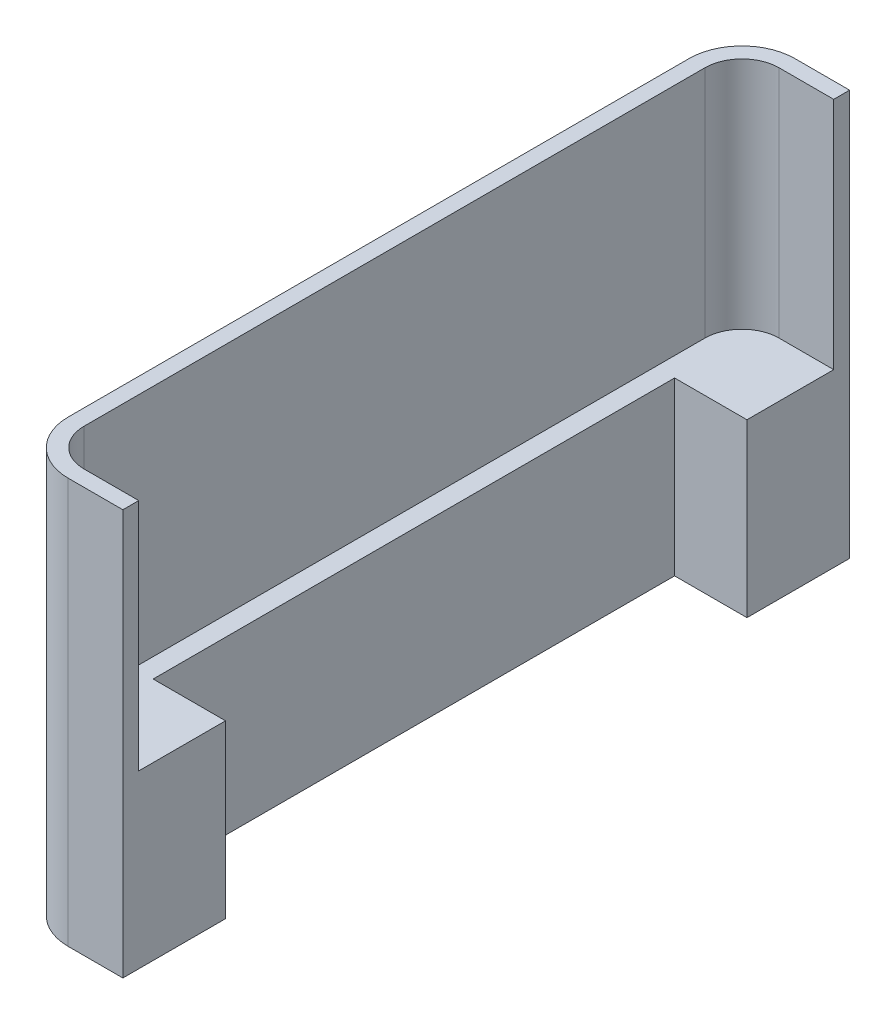
ISO-10303-21;
HEADER;
FILE_DESCRIPTION(('STEP AP214'),'2;1');
FILE_NAME('part.step','',(''),(''),'','','');
FILE_SCHEMA(('AUTOMOTIVE_DESIGN { 1 0 10303 214 1 1 1 1 }'));
ENDSEC;
DATA;
#1=APPLICATION_CONTEXT('core data for automotive mechanical design processes');
#2=APPLICATION_PROTOCOL_DEFINITION('international standard','automotive_design',2000,#1);
#3=PRODUCT_CONTEXT('',#1,'mechanical');
#4=PRODUCT('Part','Part','',(#3));
#5=PRODUCT_RELATED_PRODUCT_CATEGORY('part','',(#4));
#6=PRODUCT_DEFINITION_FORMATION('','',#4);
#7=PRODUCT_DEFINITION_CONTEXT('part definition',#1,'design');
#8=PRODUCT_DEFINITION('design','',#6,#7);
#9=PRODUCT_DEFINITION_SHAPE('','',#8);
#10=(LENGTH_UNIT() NAMED_UNIT(*) SI_UNIT(.MILLI.,.METRE.));
#11=(NAMED_UNIT(*) PLANE_ANGLE_UNIT() SI_UNIT($,.RADIAN.));
#12=(NAMED_UNIT(*) SI_UNIT($,.STERADIAN.) SOLID_ANGLE_UNIT());
#13=UNCERTAINTY_MEASURE_WITH_UNIT(LENGTH_MEASURE(1.E-05),#10,'distance_accuracy_value','');
#14=(GEOMETRIC_REPRESENTATION_CONTEXT(3) GLOBAL_UNCERTAINTY_ASSIGNED_CONTEXT((#13)) GLOBAL_UNIT_ASSIGNED_CONTEXT((#10,
#11,#12)) REPRESENTATION_CONTEXT('',''));
#15=CARTESIAN_POINT('',(0.,0.,0.));
#16=DIRECTION('',(0.,0.,1.));
#17=DIRECTION('',(1.,0.,0.));
#18=AXIS2_PLACEMENT_3D('',#15,#16,#17);
#19=CARTESIAN_POINT('',(-43.055,55.4230459880413,11.115));
#20=DIRECTION('',(-1.,0.,0.));
#21=DIRECTION('',(0.,0.,1.));
#22=AXIS2_PLACEMENT_3D('',#19,#20,#21);
#23=PLANE('',#22);
#24=DIRECTION('',(0.,0.,1.));
#25=VECTOR('',#24,1.);
#26=CARTESIAN_POINT('',(-43.055,9.7,10.365));
#27=LINE('',#26,#25);
#28=CARTESIAN_POINT('',(-43.055,9.7,6.27000000000001));
#29=VERTEX_POINT('',#28);
#30=CARTESIAN_POINT('',(-43.055,9.7,10.365));
#31=VERTEX_POINT('',#30);
#32=EDGE_CURVE('E294',#29,#31,#27,.T.);
#33=ORIENTED_EDGE('',*,*,#32,.T.);
#34=DIRECTION('',(0.,1.,0.));
#35=VECTOR('',#34,1.);
#36=CARTESIAN_POINT('',(-43.055,-23.3845719331534,10.365));
#37=LINE('',#36,#35);
#38=CARTESIAN_POINT('',(-43.055,20.7489,10.365));
#39=VERTEX_POINT('',#38);
#40=EDGE_CURVE('E183',#31,#39,#37,.T.);
#41=ORIENTED_EDGE('',*,*,#40,.T.);
#42=DIRECTION('',(0.,0.,-1.));
#43=VECTOR('',#42,1.);
#44=CARTESIAN_POINT('',(-43.055,20.7489,11.115));
#45=LINE('',#44,#43);
#46=CARTESIAN_POINT('',(-43.055,20.7489,11.115));
#47=VERTEX_POINT('',#46);
#48=EDGE_CURVE('E229',#47,#39,#45,.T.);
#49=ORIENTED_EDGE('',*,*,#48,.F.);
#50=DIRECTION('',(0.,-1.,0.));
#51=VECTOR('',#50,1.);
#52=CARTESIAN_POINT('',(-43.055,55.4230459880413,11.115));
#53=LINE('',#52,#51);
#54=CARTESIAN_POINT('',(-43.055,1.61,11.115));
#55=VERTEX_POINT('',#54);
#56=EDGE_CURVE('E226',#47,#55,#53,.T.);
#57=ORIENTED_EDGE('',*,*,#56,.T.);
#58=DIRECTION('',(0.,0.,-1.));
#59=VECTOR('',#58,1.);
#60=CARTESIAN_POINT('',(-43.055,1.61,11.115));
#61=LINE('',#60,#59);
#62=CARTESIAN_POINT('',(-43.055,1.61,6.27000000000001));
#63=VERTEX_POINT('',#62);
#64=EDGE_CURVE('E220',#55,#63,#61,.T.);
#65=ORIENTED_EDGE('',*,*,#64,.T.);
#66=DIRECTION('',(0.,1.,0.));
#67=VECTOR('',#66,1.);
#68=CARTESIAN_POINT('',(-43.055,1.61,6.27000000000001));
#69=LINE('',#68,#67);
#70=EDGE_CURVE('E212',#63,#29,#69,.T.);
#71=ORIENTED_EDGE('',*,*,#70,.T.);
#72=EDGE_LOOP('',(#33,#41,#49,#57,#65,#71));
#73=FACE_BOUND('',#72,.T.);
#74=ADVANCED_FACE('F33',(#73),#23,.F.);
#75=CARTESIAN_POINT('',(-43.055,20.7489,-22.435));
#76=VERTEX_POINT('',#75);
#77=CARTESIAN_POINT('',(-43.055,20.7489,-23.185));
#78=VERTEX_POINT('',#77);
#79=EDGE_CURVE('E233',#76,#78,#45,.T.);
#80=ORIENTED_EDGE('',*,*,#79,.F.);
#81=DIRECTION('',(0.,1.,0.));
#82=VECTOR('',#81,1.);
#83=CARTESIAN_POINT('',(-43.055,-23.3845719331534,-22.435));
#84=LINE('',#83,#82);
#85=CARTESIAN_POINT('',(-43.055,9.7,-22.435));
#86=VERTEX_POINT('',#85);
#87=EDGE_CURVE('E165',#86,#76,#84,.T.);
#88=ORIENTED_EDGE('',*,*,#87,.F.);
#89=CARTESIAN_POINT('',(-43.055,9.7,-18.34));
#90=VERTEX_POINT('',#89);
#91=EDGE_CURVE('E292',#86,#90,#27,.T.);
#92=ORIENTED_EDGE('',*,*,#91,.T.);
#93=DIRECTION('',(0.,1.,0.));
#94=VECTOR('',#93,1.);
#95=CARTESIAN_POINT('',(-43.055,1.61,-18.34));
#96=LINE('',#95,#94);
#97=CARTESIAN_POINT('',(-43.055,1.61,-18.34));
#98=VERTEX_POINT('',#97);
#99=EDGE_CURVE('E201',#98,#90,#96,.T.);
#100=ORIENTED_EDGE('',*,*,#99,.F.);
#101=CARTESIAN_POINT('',(-43.055,1.61,-23.185));
#102=VERTEX_POINT('',#101);
#103=EDGE_CURVE('E223',#98,#102,#61,.T.);
#104=ORIENTED_EDGE('',*,*,#103,.T.);
#105=DIRECTION('',(0.,-1.,0.));
#106=VECTOR('',#105,1.);
#107=CARTESIAN_POINT('',(-43.055,55.4230459880413,-23.185));
#108=LINE('',#107,#106);
#109=EDGE_CURVE('E219',#78,#102,#108,.T.);
#110=ORIENTED_EDGE('',*,*,#109,.F.);
#111=EDGE_LOOP('',(#80,#88,#92,#100,#104,#110));
#112=FACE_BOUND('',#111,.T.);
#113=ADVANCED_FACE('F283',(#112),#23,.F.);
#114=CARTESIAN_POINT('',(0.,1.61,0.));
#115=DIRECTION('',(0.,-1.,0.));
#116=DIRECTION('',(0.,0.,-1.));
#117=AXIS2_PLACEMENT_3D('',#114,#115,#116);
#118=PLANE('',#117);
#119=DIRECTION('',(0.,0.,-1.));
#120=VECTOR('',#119,1.);
#121=CARTESIAN_POINT('',(-46.47,1.61,6.27000000000001));
#122=LINE('',#121,#120);
#123=CARTESIAN_POINT('',(-46.47,1.61,6.27000000000001));
#124=VERTEX_POINT('',#123);
#125=CARTESIAN_POINT('',(-46.47,1.61,-18.34));
#126=VERTEX_POINT('',#125);
#127=EDGE_CURVE('E196',#124,#126,#122,.T.);
#128=ORIENTED_EDGE('',*,*,#127,.F.);
#129=DIRECTION('',(-1.,0.,0.));
#130=VECTOR('',#129,1.);
#131=CARTESIAN_POINT('',(-43.055,1.61,6.27000000000001));
#132=LINE('',#131,#130);
#133=EDGE_CURVE('E194',#63,#124,#132,.T.);
#134=ORIENTED_EDGE('',*,*,#133,.F.);
#135=ORIENTED_EDGE('',*,*,#64,.F.);
#136=DIRECTION('',(1.,0.,0.));
#137=VECTOR('',#136,1.);
#138=CARTESIAN_POINT('',(-48.135,1.61,11.115));
#139=LINE('',#138,#137);
#140=CARTESIAN_POINT('',(-45.635,1.61,11.115));
#141=VERTEX_POINT('',#140);
#142=EDGE_CURVE('E224',#141,#55,#139,.T.);
#143=ORIENTED_EDGE('',*,*,#142,.F.);
#144=CARTESIAN_POINT('',(-45.635,1.61,8.61500000000001));
#145=DIRECTION('',(0.,-1.,0.));
#146=DIRECTION('',(0.,0.,-1.));
#147=AXIS2_PLACEMENT_3D('',#144,#145,#146);
#148=CIRCLE('',#147,2.5);
#149=CARTESIAN_POINT('',(-48.135,1.61,8.61500000000001));
#150=VERTEX_POINT('',#149);
#151=EDGE_CURVE('E248',#141,#150,#148,.T.);
#152=ORIENTED_EDGE('',*,*,#151,.T.);
#153=DIRECTION('',(0.,0.,1.));
#154=VECTOR('',#153,1.);
#155=CARTESIAN_POINT('',(-48.135,1.61,11.115));
#156=LINE('',#155,#154);
#157=CARTESIAN_POINT('',(-48.135,1.61,-20.685));
#158=VERTEX_POINT('',#157);
#159=EDGE_CURVE('E215',#158,#150,#156,.T.);
#160=ORIENTED_EDGE('',*,*,#159,.F.);
#161=CARTESIAN_POINT('',(-45.635,1.61,-20.685));
#162=DIRECTION('',(0.,-1.,0.));
#163=DIRECTION('',(0.,0.,-1.));
#164=AXIS2_PLACEMENT_3D('',#161,#162,#163);
#165=CIRCLE('',#164,2.5);
#166=CARTESIAN_POINT('',(-45.635,1.61,-23.185));
#167=VERTEX_POINT('',#166);
#168=EDGE_CURVE('E246',#158,#167,#165,.T.);
#169=ORIENTED_EDGE('',*,*,#168,.T.);
#170=DIRECTION('',(-1.,0.,0.));
#171=VECTOR('',#170,1.);
#172=CARTESIAN_POINT('',(-48.135,1.61,-23.185));
#173=LINE('',#172,#171);
#174=EDGE_CURVE('E216',#102,#167,#173,.T.);
#175=ORIENTED_EDGE('',*,*,#174,.F.);
#176=ORIENTED_EDGE('',*,*,#103,.F.);
#177=DIRECTION('',(1.,0.,0.));
#178=VECTOR('',#177,1.);
#179=CARTESIAN_POINT('',(-43.055,1.61,-18.34));
#180=LINE('',#179,#178);
#181=EDGE_CURVE('E199',#126,#98,#180,.T.);
#182=ORIENTED_EDGE('',*,*,#181,.F.);
#183=EDGE_LOOP('',(#128,#134,#135,#143,#152,#160,#169,#175,#176,#182));
#184=FACE_BOUND('',#183,.T.);
#185=ADVANCED_FACE('F271',(#184),#118,.T.);
#186=CARTESIAN_POINT('',(-48.135,55.4230459880413,11.115));
#187=DIRECTION('',(1.,0.,0.));
#188=DIRECTION('',(0.,0.,-1.));
#189=AXIS2_PLACEMENT_3D('',#186,#187,#188);
#190=PLANE('',#189);
#191=ORIENTED_EDGE('',*,*,#159,.T.);
#192=DIRECTION('',(0.,-1.,0.));
#193=VECTOR('',#192,1.);
#194=CARTESIAN_POINT('',(-48.135,55.4230459880413,8.61500000000001));
#195=LINE('',#194,#193);
#196=CARTESIAN_POINT('',(-48.135,20.7489,8.61500000000001));
#197=VERTEX_POINT('',#196);
#198=EDGE_CURVE('E253',#150,#197,#195,.F.);
#199=ORIENTED_EDGE('',*,*,#198,.T.);
#200=DIRECTION('',(0.,0.,1.));
#201=VECTOR('',#200,1.);
#202=CARTESIAN_POINT('',(-48.135,20.7489,11.115));
#203=LINE('',#202,#201);
#204=CARTESIAN_POINT('',(-48.135,20.7489,-20.685));
#205=VERTEX_POINT('',#204);
#206=EDGE_CURVE('E236',#205,#197,#203,.T.);
#207=ORIENTED_EDGE('',*,*,#206,.F.);
#208=DIRECTION('',(0.,-1.,0.));
#209=VECTOR('',#208,1.);
#210=CARTESIAN_POINT('',(-48.135,55.4230459880413,-20.685));
#211=LINE('',#210,#209);
#212=EDGE_CURVE('E250',#205,#158,#211,.T.);
#213=ORIENTED_EDGE('',*,*,#212,.T.);
#214=EDGE_LOOP('',(#191,#199,#207,#213));
#215=FACE_BOUND('',#214,.T.);
#216=ADVANCED_FACE('F274',(#215),#190,.F.);
#217=CARTESIAN_POINT('',(-48.135,55.4230459880413,11.115));
#218=DIRECTION('',(0.,0.,-1.));
#219=DIRECTION('',(-1.,0.,0.));
#220=AXIS2_PLACEMENT_3D('',#217,#218,#219);
#221=PLANE('',#220);
#222=DIRECTION('',(1.,0.,0.));
#223=VECTOR('',#222,1.);
#224=CARTESIAN_POINT('',(-48.135,20.7489,11.115));
#225=LINE('',#224,#223);
#226=CARTESIAN_POINT('',(-45.635,20.7489,11.115));
#227=VERTEX_POINT('',#226);
#228=EDGE_CURVE('E234',#227,#47,#225,.T.);
#229=ORIENTED_EDGE('',*,*,#228,.F.);
#230=DIRECTION('',(0.,-1.,0.));
#231=VECTOR('',#230,1.);
#232=CARTESIAN_POINT('',(-45.635,55.4230459880413,11.115));
#233=LINE('',#232,#231);
#234=EDGE_CURVE('E232',#227,#141,#233,.T.);
#235=ORIENTED_EDGE('',*,*,#234,.T.);
#236=ORIENTED_EDGE('',*,*,#142,.T.);
#237=ORIENTED_EDGE('',*,*,#56,.F.);
#238=EDGE_LOOP('',(#229,#235,#236,#237));
#239=FACE_BOUND('',#238,.T.);
#240=ADVANCED_FACE('F265',(#239),#221,.F.);
#241=CARTESIAN_POINT('',(-48.135,55.4230459880413,-23.185));
#242=DIRECTION('',(0.,0.,1.));
#243=DIRECTION('',(1.,0.,0.));
#244=AXIS2_PLACEMENT_3D('',#241,#242,#243);
#245=PLANE('',#244);
#246=ORIENTED_EDGE('',*,*,#174,.T.);
#247=DIRECTION('',(0.,-1.,0.));
#248=VECTOR('',#247,1.);
#249=CARTESIAN_POINT('',(-45.635,55.4230459880413,-23.185));
#250=LINE('',#249,#248);
#251=CARTESIAN_POINT('',(-45.635,20.7489,-23.185));
#252=VERTEX_POINT('',#251);
#253=EDGE_CURVE('E11',#167,#252,#250,.F.);
#254=ORIENTED_EDGE('',*,*,#253,.T.);
#255=DIRECTION('',(-1.,0.,0.));
#256=VECTOR('',#255,1.);
#257=CARTESIAN_POINT('',(-48.135,20.7489,-23.185));
#258=LINE('',#257,#256);
#259=EDGE_CURVE('E218',#78,#252,#258,.T.);
#260=ORIENTED_EDGE('',*,*,#259,.F.);
#261=ORIENTED_EDGE('',*,*,#109,.T.);
#262=EDGE_LOOP('',(#246,#254,#260,#261));
#263=FACE_BOUND('',#262,.T.);
#264=ADVANCED_FACE('F280',(#263),#245,.F.);
#265=CARTESIAN_POINT('',(5.20499999999999,20.7489,8.56999999999999));
#266=DIRECTION('',(0.,1.,0.));
#267=DIRECTION('',(0.,0.,1.));
#268=AXIS2_PLACEMENT_3D('',#265,#266,#267);
#269=PLANE('',#268);
#270=DIRECTION('',(-1.,0.,0.));
#271=VECTOR('',#270,1.);
#272=CARTESIAN_POINT('',(-43.055,20.7489,-22.435));
#273=LINE('',#272,#271);
#274=CARTESIAN_POINT('',(-45.635,20.7489,-22.435));
#275=VERTEX_POINT('',#274);
#276=EDGE_CURVE('E162',#76,#275,#273,.T.);
#277=ORIENTED_EDGE('',*,*,#276,.F.);
#278=ORIENTED_EDGE('',*,*,#79,.T.);
#279=ORIENTED_EDGE('',*,*,#259,.T.);
#280=CARTESIAN_POINT('',(-45.635,20.7489,-20.685));
#281=DIRECTION('',(0.,1.,0.));
#282=DIRECTION('',(0.,0.,1.));
#283=AXIS2_PLACEMENT_3D('',#280,#281,#282);
#284=CIRCLE('',#283,2.5);
#285=EDGE_CURVE('E255',#252,#205,#284,.T.);
#286=ORIENTED_EDGE('',*,*,#285,.T.);
#287=ORIENTED_EDGE('',*,*,#206,.T.);
#288=CARTESIAN_POINT('',(-45.635,20.7489,8.61500000000001));
#289=DIRECTION('',(0.,1.,0.));
#290=DIRECTION('',(0.,0.,1.));
#291=AXIS2_PLACEMENT_3D('',#288,#289,#290);
#292=CIRCLE('',#291,2.5);
#293=EDGE_CURVE('E41',#197,#227,#292,.T.);
#294=ORIENTED_EDGE('',*,*,#293,.T.);
#295=ORIENTED_EDGE('',*,*,#228,.T.);
#296=ORIENTED_EDGE('',*,*,#48,.T.);
#297=DIRECTION('',(1.,0.,0.));
#298=VECTOR('',#297,1.);
#299=CARTESIAN_POINT('',(-45.635,20.7489,10.365));
#300=LINE('',#299,#298);
#301=CARTESIAN_POINT('',(-45.635,20.7489,10.365));
#302=VERTEX_POINT('',#301);
#303=EDGE_CURVE('E159',#302,#39,#300,.T.);
#304=ORIENTED_EDGE('',*,*,#303,.F.);
#305=CARTESIAN_POINT('',(-45.635,20.7489,8.61500000000001));
#306=DIRECTION('',(0.,1.,0.));
#307=DIRECTION('',(0.,0.,1.));
#308=AXIS2_PLACEMENT_3D('',#305,#306,#307);
#309=CIRCLE('',#308,1.75);
#310=CARTESIAN_POINT('',(-47.385,20.7489,8.61500000000001));
#311=VERTEX_POINT('',#310);
#312=EDGE_CURVE('E174',#311,#302,#309,.T.);
#313=ORIENTED_EDGE('',*,*,#312,.F.);
#314=DIRECTION('',(0.,0.,1.));
#315=VECTOR('',#314,1.);
#316=CARTESIAN_POINT('',(-47.385,20.7489,-20.685));
#317=LINE('',#316,#315);
#318=CARTESIAN_POINT('',(-47.385,20.7489,-20.685));
#319=VERTEX_POINT('',#318);
#320=EDGE_CURVE('E172',#319,#311,#317,.T.);
#321=ORIENTED_EDGE('',*,*,#320,.F.);
#322=CARTESIAN_POINT('',(-45.635,20.7489,-20.685));
#323=DIRECTION('',(0.,1.,0.));
#324=DIRECTION('',(0.,0.,1.));
#325=AXIS2_PLACEMENT_3D('',#322,#323,#324);
#326=CIRCLE('',#325,1.75);
#327=EDGE_CURVE('E152',#275,#319,#326,.T.);
#328=ORIENTED_EDGE('',*,*,#327,.F.);
#329=EDGE_LOOP('',(#277,#278,#279,#286,#287,#294,#295,#296,#304,#313,#321,#328));
#330=FACE_BOUND('',#329,.T.);
#331=ADVANCED_FACE('F169',(#330),#269,.T.);
#332=CARTESIAN_POINT('',(-45.635,55.4230459880413,8.61500000000001));
#333=DIRECTION('',(0.,-1.,0.));
#334=DIRECTION('',(0.,0.,-1.));
#335=AXIS2_PLACEMENT_3D('',#332,#333,#334);
#336=CYLINDRICAL_SURFACE('',#335,2.5);
#337=ORIENTED_EDGE('',*,*,#293,.F.);
#338=ORIENTED_EDGE('',*,*,#198,.F.);
#339=ORIENTED_EDGE('',*,*,#151,.F.);
#340=ORIENTED_EDGE('',*,*,#234,.F.);
#341=EDGE_LOOP('',(#337,#338,#339,#340));
#342=FACE_BOUND('',#341,.T.);
#343=ADVANCED_FACE('F267',(#342),#336,.T.);
#344=CARTESIAN_POINT('',(-45.635,55.4230459880413,-20.685));
#345=DIRECTION('',(0.,-1.,0.));
#346=DIRECTION('',(0.,0.,-1.));
#347=AXIS2_PLACEMENT_3D('',#344,#345,#346);
#348=CYLINDRICAL_SURFACE('',#347,2.5);
#349=ORIENTED_EDGE('',*,*,#285,.F.);
#350=ORIENTED_EDGE('',*,*,#253,.F.);
#351=ORIENTED_EDGE('',*,*,#168,.F.);
#352=ORIENTED_EDGE('',*,*,#212,.F.);
#353=EDGE_LOOP('',(#349,#350,#351,#352));
#354=FACE_BOUND('',#353,.T.);
#355=ADVANCED_FACE('F35',(#354),#348,.T.);
#356=CARTESIAN_POINT('',(-43.055,1.61,6.27000000000001));
#357=DIRECTION('',(0.,0.,-1.));
#358=DIRECTION('',(-1.,0.,0.));
#359=AXIS2_PLACEMENT_3D('',#356,#357,#358);
#360=PLANE('',#359);
#361=DIRECTION('',(-1.,0.,0.));
#362=VECTOR('',#361,1.);
#363=CARTESIAN_POINT('',(-43.055,9.7,6.27000000000001));
#364=LINE('',#363,#362);
#365=CARTESIAN_POINT('',(-46.47,9.7,6.27000000000001));
#366=VERTEX_POINT('',#365);
#367=EDGE_CURVE('E192',#29,#366,#364,.T.);
#368=ORIENTED_EDGE('',*,*,#367,.F.);
#369=ORIENTED_EDGE('',*,*,#70,.F.);
#370=ORIENTED_EDGE('',*,*,#133,.T.);
#371=DIRECTION('',(0.,1.,0.));
#372=VECTOR('',#371,1.);
#373=CARTESIAN_POINT('',(-46.47,1.61,6.27000000000001));
#374=LINE('',#373,#372);
#375=EDGE_CURVE('E209',#124,#366,#374,.T.);
#376=ORIENTED_EDGE('',*,*,#375,.T.);
#377=EDGE_LOOP('',(#368,#369,#370,#376));
#378=FACE_BOUND('',#377,.T.);
#379=ADVANCED_FACE('F317',(#378),#360,.T.);
#380=CARTESIAN_POINT('',(-46.47,1.61,6.27000000000001));
#381=DIRECTION('',(1.,0.,0.));
#382=DIRECTION('',(0.,0.,-1.));
#383=AXIS2_PLACEMENT_3D('',#380,#381,#382);
#384=PLANE('',#383);
#385=DIRECTION('',(0.,0.,-1.));
#386=VECTOR('',#385,1.);
#387=CARTESIAN_POINT('',(-46.47,9.7,6.27000000000001));
#388=LINE('',#387,#386);
#389=CARTESIAN_POINT('',(-46.47,9.7,-18.34));
#390=VERTEX_POINT('',#389);
#391=EDGE_CURVE('E203',#366,#390,#388,.T.);
#392=ORIENTED_EDGE('',*,*,#391,.F.);
#393=ORIENTED_EDGE('',*,*,#375,.F.);
#394=ORIENTED_EDGE('',*,*,#127,.T.);
#395=DIRECTION('',(0.,1.,0.));
#396=VECTOR('',#395,1.);
#397=CARTESIAN_POINT('',(-46.47,1.61,-18.34));
#398=LINE('',#397,#396);
#399=EDGE_CURVE('E48',#126,#390,#398,.T.);
#400=ORIENTED_EDGE('',*,*,#399,.T.);
#401=EDGE_LOOP('',(#392,#393,#394,#400));
#402=FACE_BOUND('',#401,.T.);
#403=ADVANCED_FACE('F320',(#402),#384,.T.);
#404=CARTESIAN_POINT('',(-43.055,1.61,-18.34));
#405=DIRECTION('',(0.,0.,1.));
#406=DIRECTION('',(1.,0.,0.));
#407=AXIS2_PLACEMENT_3D('',#404,#405,#406);
#408=PLANE('',#407);
#409=DIRECTION('',(1.,0.,0.));
#410=VECTOR('',#409,1.);
#411=CARTESIAN_POINT('',(-43.055,9.7,-18.34));
#412=LINE('',#411,#410);
#413=EDGE_CURVE('E197',#390,#90,#412,.T.);
#414=ORIENTED_EDGE('',*,*,#413,.F.);
#415=ORIENTED_EDGE('',*,*,#399,.F.);
#416=ORIENTED_EDGE('',*,*,#181,.T.);
#417=ORIENTED_EDGE('',*,*,#99,.T.);
#418=EDGE_LOOP('',(#414,#415,#416,#417));
#419=FACE_BOUND('',#418,.T.);
#420=ADVANCED_FACE('F288',(#419),#408,.T.);
#421=CARTESIAN_POINT('',(-43.055,-23.3845719331534,-22.435));
#422=DIRECTION('',(0.,0.,-1.));
#423=DIRECTION('',(-1.,0.,0.));
#424=AXIS2_PLACEMENT_3D('',#421,#422,#423);
#425=PLANE('',#424);
#426=DIRECTION('',(1.,0.,0.));
#427=VECTOR('',#426,1.);
#428=CARTESIAN_POINT('',(-43.055,9.7,-22.435));
#429=LINE('',#428,#427);
#430=CARTESIAN_POINT('',(-45.635,9.7,-22.435));
#431=VERTEX_POINT('',#430);
#432=EDGE_CURVE('E193',#431,#86,#429,.T.);
#433=ORIENTED_EDGE('',*,*,#432,.T.);
#434=ORIENTED_EDGE('',*,*,#87,.T.);
#435=ORIENTED_EDGE('',*,*,#276,.T.);
#436=DIRECTION('',(0.,1.,0.));
#437=VECTOR('',#436,1.);
#438=CARTESIAN_POINT('',(-45.635,-23.3845719331534,-22.435));
#439=LINE('',#438,#437);
#440=EDGE_CURVE('E147',#431,#275,#439,.T.);
#441=ORIENTED_EDGE('',*,*,#440,.F.);
#442=EDGE_LOOP('',(#433,#434,#435,#441));
#443=FACE_BOUND('',#442,.T.);
#444=ADVANCED_FACE('F163',(#443),#425,.F.);
#445=CARTESIAN_POINT('',(-45.635,-23.3845719331534,10.365));
#446=DIRECTION('',(0.,0.,1.));
#447=DIRECTION('',(1.,0.,0.));
#448=AXIS2_PLACEMENT_3D('',#445,#446,#447);
#449=PLANE('',#448);
#450=DIRECTION('',(-1.,0.,0.));
#451=VECTOR('',#450,1.);
#452=CARTESIAN_POINT('',(-45.635,9.7,10.365));
#453=LINE('',#452,#451);
#454=CARTESIAN_POINT('',(-45.635,9.7,10.365));
#455=VERTEX_POINT('',#454);
#456=EDGE_CURVE('E297',#31,#455,#453,.T.);
#457=ORIENTED_EDGE('',*,*,#456,.T.);
#458=DIRECTION('',(0.,1.,0.));
#459=VECTOR('',#458,1.);
#460=CARTESIAN_POINT('',(-45.635,-23.3845719331534,10.365));
#461=LINE('',#460,#459);
#462=EDGE_CURVE('E186',#455,#302,#461,.T.);
#463=ORIENTED_EDGE('',*,*,#462,.T.);
#464=ORIENTED_EDGE('',*,*,#303,.T.);
#465=ORIENTED_EDGE('',*,*,#40,.F.);
#466=EDGE_LOOP('',(#457,#463,#464,#465));
#467=FACE_BOUND('',#466,.T.);
#468=ADVANCED_FACE('F313',(#467),#449,.F.);
#469=CARTESIAN_POINT('',(-45.635,-23.3845719331534,8.61500000000001));
#470=DIRECTION('',(0.,1.,0.));
#471=DIRECTION('',(0.,0.,1.));
#472=AXIS2_PLACEMENT_3D('',#469,#470,#471);
#473=CYLINDRICAL_SURFACE('',#472,1.75);
#474=CARTESIAN_POINT('',(-45.635,9.7,8.61500000000001));
#475=DIRECTION('',(0.,1.,0.));
#476=DIRECTION('',(0.,0.,1.));
#477=AXIS2_PLACEMENT_3D('',#474,#475,#476);
#478=CIRCLE('',#477,1.75);
#479=CARTESIAN_POINT('',(-47.385,9.7,8.615));
#480=VERTEX_POINT('',#479);
#481=EDGE_CURVE('E300',#455,#480,#478,.F.);
#482=ORIENTED_EDGE('',*,*,#481,.T.);
#483=DIRECTION('',(0.,1.,0.));
#484=VECTOR('',#483,1.);
#485=CARTESIAN_POINT('',(-47.385,-23.3845719331534,8.61500000000001));
#486=LINE('',#485,#484);
#487=EDGE_CURVE('E188',#480,#311,#486,.T.);
#488=ORIENTED_EDGE('',*,*,#487,.T.);
#489=ORIENTED_EDGE('',*,*,#312,.T.);
#490=ORIENTED_EDGE('',*,*,#462,.F.);
#491=EDGE_LOOP('',(#482,#488,#489,#490));
#492=FACE_BOUND('',#491,.T.);
#493=ADVANCED_FACE('F310',(#492),#473,.F.);
#494=CARTESIAN_POINT('',(-47.385,-23.3845719331534,-20.685));
#495=DIRECTION('',(-1.,0.,0.));
#496=DIRECTION('',(0.,0.,1.));
#497=AXIS2_PLACEMENT_3D('',#494,#495,#496);
#498=PLANE('',#497);
#499=DIRECTION('',(0.,0.,-1.));
#500=VECTOR('',#499,1.);
#501=CARTESIAN_POINT('',(-47.385,9.7,-20.685));
#502=LINE('',#501,#500);
#503=CARTESIAN_POINT('',(-47.385,9.7,-20.685));
#504=VERTEX_POINT('',#503);
#505=EDGE_CURVE('E182',#480,#504,#502,.T.);
#506=ORIENTED_EDGE('',*,*,#505,.T.);
#507=DIRECTION('',(0.,1.,0.));
#508=VECTOR('',#507,1.);
#509=CARTESIAN_POINT('',(-47.385,-23.3845719331534,-20.685));
#510=LINE('',#509,#508);
#511=EDGE_CURVE('E158',#504,#319,#510,.T.);
#512=ORIENTED_EDGE('',*,*,#511,.T.);
#513=ORIENTED_EDGE('',*,*,#320,.T.);
#514=ORIENTED_EDGE('',*,*,#487,.F.);
#515=EDGE_LOOP('',(#506,#512,#513,#514));
#516=FACE_BOUND('',#515,.T.);
#517=ADVANCED_FACE('F305',(#516),#498,.F.);
#518=CARTESIAN_POINT('',(-45.635,-23.3845719331534,-20.685));
#519=DIRECTION('',(0.,1.,0.));
#520=DIRECTION('',(0.,0.,1.));
#521=AXIS2_PLACEMENT_3D('',#518,#519,#520);
#522=CYLINDRICAL_SURFACE('',#521,1.75);
#523=CARTESIAN_POINT('',(-45.635,9.7,-20.685));
#524=DIRECTION('',(0.,1.,0.));
#525=DIRECTION('',(0.,0.,1.));
#526=AXIS2_PLACEMENT_3D('',#523,#524,#525);
#527=CIRCLE('',#526,1.75);
#528=EDGE_CURVE('E155',#504,#431,#527,.F.);
#529=ORIENTED_EDGE('',*,*,#528,.T.);
#530=ORIENTED_EDGE('',*,*,#440,.T.);
#531=ORIENTED_EDGE('',*,*,#327,.T.);
#532=ORIENTED_EDGE('',*,*,#511,.F.);
#533=EDGE_LOOP('',(#529,#530,#531,#532));
#534=FACE_BOUND('',#533,.T.);
#535=ADVANCED_FACE('F149',(#534),#522,.F.);
#536=CARTESIAN_POINT('',(0.,9.7,0.));
#537=DIRECTION('',(0.,1.,0.));
#538=DIRECTION('',(0.,0.,1.));
#539=AXIS2_PLACEMENT_3D('',#536,#537,#538);
#540=PLANE('',#539);
#541=ORIENTED_EDGE('',*,*,#391,.T.);
#542=ORIENTED_EDGE('',*,*,#413,.T.);
#543=ORIENTED_EDGE('',*,*,#91,.F.);
#544=ORIENTED_EDGE('',*,*,#432,.F.);
#545=ORIENTED_EDGE('',*,*,#528,.F.);
#546=ORIENTED_EDGE('',*,*,#505,.F.);
#547=ORIENTED_EDGE('',*,*,#481,.F.);
#548=ORIENTED_EDGE('',*,*,#456,.F.);
#549=ORIENTED_EDGE('',*,*,#32,.F.);
#550=ORIENTED_EDGE('',*,*,#367,.T.);
#551=EDGE_LOOP('',(#541,#542,#543,#544,#545,#546,#547,#548,#549,#550));
#552=FACE_BOUND('',#551,.T.);
#553=ADVANCED_FACE('F291',(#552),#540,.T.);
#554=CLOSED_SHELL('',(#74,#113,#185,#216,#240,#264,#331,#343,#355,#379,#403,#420,#444,#468,#493,
#517,#535,#553));
#555=MANIFOLD_SOLID_BREP('B2',#554);
#556=ADVANCED_BREP_SHAPE_REPRESENTATION('',(#18,#555),#14);
#557=SHAPE_DEFINITION_REPRESENTATION(#9,#556);
ENDSEC;
END-ISO-10303-21;
